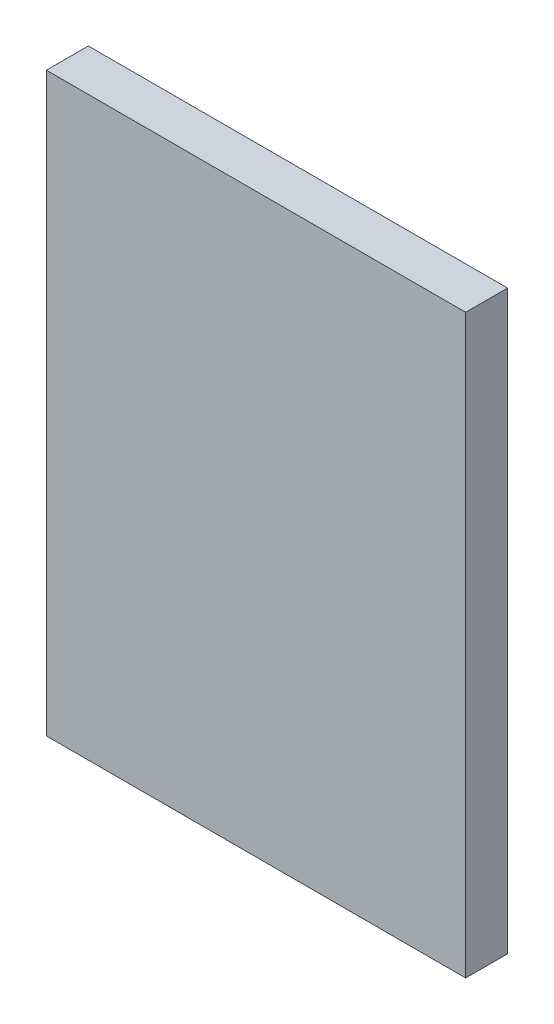
ISO-10303-21;
HEADER;
FILE_DESCRIPTION(('STEP AP214'),'2;1');
FILE_NAME('part.step','',(''),(''),'','','');
FILE_SCHEMA(('AUTOMOTIVE_DESIGN { 1 0 10303 214 1 1 1 1 }'));
ENDSEC;
DATA;
#1=APPLICATION_CONTEXT('core data for automotive mechanical design processes');
#2=APPLICATION_PROTOCOL_DEFINITION('international standard','automotive_design',2000,#1);
#3=PRODUCT_CONTEXT('',#1,'mechanical');
#4=PRODUCT('Part','Part','',(#3));
#5=PRODUCT_RELATED_PRODUCT_CATEGORY('part','',(#4));
#6=PRODUCT_DEFINITION_FORMATION('','',#4);
#7=PRODUCT_DEFINITION_CONTEXT('part definition',#1,'design');
#8=PRODUCT_DEFINITION('design','',#6,#7);
#9=PRODUCT_DEFINITION_SHAPE('','',#8);
#10=(LENGTH_UNIT() NAMED_UNIT(*) SI_UNIT(.MILLI.,.METRE.));
#11=(NAMED_UNIT(*) PLANE_ANGLE_UNIT() SI_UNIT($,.RADIAN.));
#12=(NAMED_UNIT(*) SI_UNIT($,.STERADIAN.) SOLID_ANGLE_UNIT());
#13=UNCERTAINTY_MEASURE_WITH_UNIT(LENGTH_MEASURE(1.E-05),#10,'distance_accuracy_value','');
#14=(GEOMETRIC_REPRESENTATION_CONTEXT(3) GLOBAL_UNCERTAINTY_ASSIGNED_CONTEXT((#13)) GLOBAL_UNIT_ASSIGNED_CONTEXT((#10,
#11,#12)) REPRESENTATION_CONTEXT('',''));
#15=CARTESIAN_POINT('',(0.,0.,0.));
#16=DIRECTION('',(0.,0.,1.));
#17=DIRECTION('',(1.,0.,0.));
#18=AXIS2_PLACEMENT_3D('',#15,#16,#17);
#19=CARTESIAN_POINT('',(0.,0.,1.2));
#20=DIRECTION('',(0.,0.,1.));
#21=DIRECTION('',(1.,0.,0.));
#22=AXIS2_PLACEMENT_3D('',#19,#20,#21);
#23=PLANE('',#22);
#24=DIRECTION('',(0.,1.,0.));
#25=VECTOR('',#24,1.);
#26=CARTESIAN_POINT('',(0.,0.,1.2));
#27=LINE('',#26,#25);
#28=CARTESIAN_POINT('',(0.,0.,1.2));
#29=VERTEX_POINT('',#28);
#30=CARTESIAN_POINT('',(0.,16.5,1.2));
#31=VERTEX_POINT('',#30);
#32=EDGE_CURVE('E90',#29,#31,#27,.T.);
#33=ORIENTED_EDGE('',*,*,#32,.F.);
#34=DIRECTION('',(1.,0.,0.));
#35=VECTOR('',#34,1.);
#36=CARTESIAN_POINT('',(0.,0.,1.2));
#37=LINE('',#36,#35);
#38=CARTESIAN_POINT('',(12.,0.,1.2));
#39=VERTEX_POINT('',#38);
#40=EDGE_CURVE('E75',#29,#39,#37,.T.);
#41=ORIENTED_EDGE('',*,*,#40,.T.);
#42=DIRECTION('',(0.,1.,0.));
#43=VECTOR('',#42,1.);
#44=CARTESIAN_POINT('',(12.,0.,1.2));
#45=LINE('',#44,#43);
#46=CARTESIAN_POINT('',(12.,16.5,1.2));
#47=VERTEX_POINT('',#46);
#48=EDGE_CURVE('E83',#39,#47,#45,.T.);
#49=ORIENTED_EDGE('',*,*,#48,.T.);
#50=DIRECTION('',(1.,0.,0.));
#51=VECTOR('',#50,1.);
#52=CARTESIAN_POINT('',(0.,16.5,1.2));
#53=LINE('',#52,#51);
#54=EDGE_CURVE('E11',#31,#47,#53,.T.);
#55=ORIENTED_EDGE('',*,*,#54,.F.);
#56=EDGE_LOOP('',(#33,#41,#49,#55));
#57=FACE_BOUND('',#56,.T.);
#58=ADVANCED_FACE('F17',(#57),#23,.T.);
#59=CARTESIAN_POINT('',(0.,0.,0.));
#60=DIRECTION('',(0.,0.,1.));
#61=DIRECTION('',(1.,0.,0.));
#62=AXIS2_PLACEMENT_3D('',#59,#60,#61);
#63=PLANE('',#62);
#64=DIRECTION('',(1.,0.,0.));
#65=VECTOR('',#64,1.);
#66=CARTESIAN_POINT('',(0.,16.5,0.));
#67=LINE('',#66,#65);
#68=CARTESIAN_POINT('',(0.,16.5,0.));
#69=VERTEX_POINT('',#68);
#70=CARTESIAN_POINT('',(12.,16.5,0.));
#71=VERTEX_POINT('',#70);
#72=EDGE_CURVE('E20',#69,#71,#67,.T.);
#73=ORIENTED_EDGE('',*,*,#72,.T.);
#74=DIRECTION('',(0.,1.,0.));
#75=VECTOR('',#74,1.);
#76=CARTESIAN_POINT('',(12.,0.,0.));
#77=LINE('',#76,#75);
#78=CARTESIAN_POINT('',(12.,0.,0.));
#79=VERTEX_POINT('',#78);
#80=EDGE_CURVE('E101',#79,#71,#77,.T.);
#81=ORIENTED_EDGE('',*,*,#80,.F.);
#82=DIRECTION('',(1.,0.,0.));
#83=VECTOR('',#82,1.);
#84=CARTESIAN_POINT('',(0.,0.,0.));
#85=LINE('',#84,#83);
#86=CARTESIAN_POINT('',(0.,0.,0.));
#87=VERTEX_POINT('',#86);
#88=EDGE_CURVE('E85',#87,#79,#85,.T.);
#89=ORIENTED_EDGE('',*,*,#88,.F.);
#90=DIRECTION('',(0.,1.,0.));
#91=VECTOR('',#90,1.);
#92=CARTESIAN_POINT('',(0.,0.,0.));
#93=LINE('',#92,#91);
#94=EDGE_CURVE('E89',#87,#69,#93,.T.);
#95=ORIENTED_EDGE('',*,*,#94,.T.);
#96=EDGE_LOOP('',(#73,#81,#89,#95));
#97=FACE_BOUND('',#96,.T.);
#98=ADVANCED_FACE('F148',(#97),#63,.F.);
#99=CARTESIAN_POINT('',(0.,16.5,0.));
#100=DIRECTION('',(0.,1.,0.));
#101=DIRECTION('',(1.,0.,0.));
#102=AXIS2_PLACEMENT_3D('',#99,#100,#101);
#103=PLANE('',#102);
#104=ORIENTED_EDGE('',*,*,#72,.F.);
#105=DIRECTION('',(0.,0.,1.));
#106=VECTOR('',#105,1.);
#107=CARTESIAN_POINT('',(0.,16.5,0.));
#108=LINE('',#107,#106);
#109=EDGE_CURVE('E94',#69,#31,#108,.T.);
#110=ORIENTED_EDGE('',*,*,#109,.T.);
#111=ORIENTED_EDGE('',*,*,#54,.T.);
#112=DIRECTION('',(0.,0.,1.));
#113=VECTOR('',#112,1.);
#114=CARTESIAN_POINT('',(12.,16.5,0.));
#115=LINE('',#114,#113);
#116=EDGE_CURVE('E103',#71,#47,#115,.T.);
#117=ORIENTED_EDGE('',*,*,#116,.F.);
#118=EDGE_LOOP('',(#104,#110,#111,#117));
#119=FACE_BOUND('',#118,.T.);
#120=ADVANCED_FACE('F137',(#119),#103,.T.);
#121=CARTESIAN_POINT('',(0.,0.,0.));
#122=DIRECTION('',(0.,1.,0.));
#123=DIRECTION('',(1.,0.,0.));
#124=AXIS2_PLACEMENT_3D('',#121,#122,#123);
#125=PLANE('',#124);
#126=DIRECTION('',(0.,0.,1.));
#127=VECTOR('',#126,1.);
#128=CARTESIAN_POINT('',(12.,0.,0.));
#129=LINE('',#128,#127);
#130=EDGE_CURVE('E80',#79,#39,#129,.T.);
#131=ORIENTED_EDGE('',*,*,#130,.T.);
#132=ORIENTED_EDGE('',*,*,#40,.F.);
#133=DIRECTION('',(0.,0.,1.));
#134=VECTOR('',#133,1.);
#135=CARTESIAN_POINT('',(0.,0.,0.));
#136=LINE('',#135,#134);
#137=EDGE_CURVE('E72',#87,#29,#136,.T.);
#138=ORIENTED_EDGE('',*,*,#137,.F.);
#139=ORIENTED_EDGE('',*,*,#88,.T.);
#140=EDGE_LOOP('',(#131,#132,#138,#139));
#141=FACE_BOUND('',#140,.T.);
#142=ADVANCED_FACE('F73',(#141),#125,.F.);
#143=CARTESIAN_POINT('',(12.,0.,0.));
#144=DIRECTION('',(1.,0.,0.));
#145=DIRECTION('',(0.,1.,0.));
#146=AXIS2_PLACEMENT_3D('',#143,#144,#145);
#147=PLANE('',#146);
#148=ORIENTED_EDGE('',*,*,#130,.F.);
#149=ORIENTED_EDGE('',*,*,#80,.T.);
#150=ORIENTED_EDGE('',*,*,#116,.T.);
#151=ORIENTED_EDGE('',*,*,#48,.F.);
#152=EDGE_LOOP('',(#148,#149,#150,#151));
#153=FACE_BOUND('',#152,.T.);
#154=ADVANCED_FACE('F122',(#153),#147,.T.);
#155=CARTESIAN_POINT('',(0.,0.,0.));
#156=DIRECTION('',(1.,0.,0.));
#157=DIRECTION('',(0.,1.,0.));
#158=AXIS2_PLACEMENT_3D('',#155,#156,#157);
#159=PLANE('',#158);
#160=ORIENTED_EDGE('',*,*,#32,.T.);
#161=ORIENTED_EDGE('',*,*,#109,.F.);
#162=ORIENTED_EDGE('',*,*,#94,.F.);
#163=ORIENTED_EDGE('',*,*,#137,.T.);
#164=EDGE_LOOP('',(#160,#161,#162,#163));
#165=FACE_BOUND('',#164,.T.);
#166=ADVANCED_FACE('F87',(#165),#159,.F.);
#167=CLOSED_SHELL('',(#58,#98,#120,#142,#154,#166));
#168=MANIFOLD_SOLID_BREP('B1',#167);
#169=ADVANCED_BREP_SHAPE_REPRESENTATION('',(#18,#168),#14);
#170=SHAPE_DEFINITION_REPRESENTATION(#9,#169);
ENDSEC;
END-ISO-10303-21;
